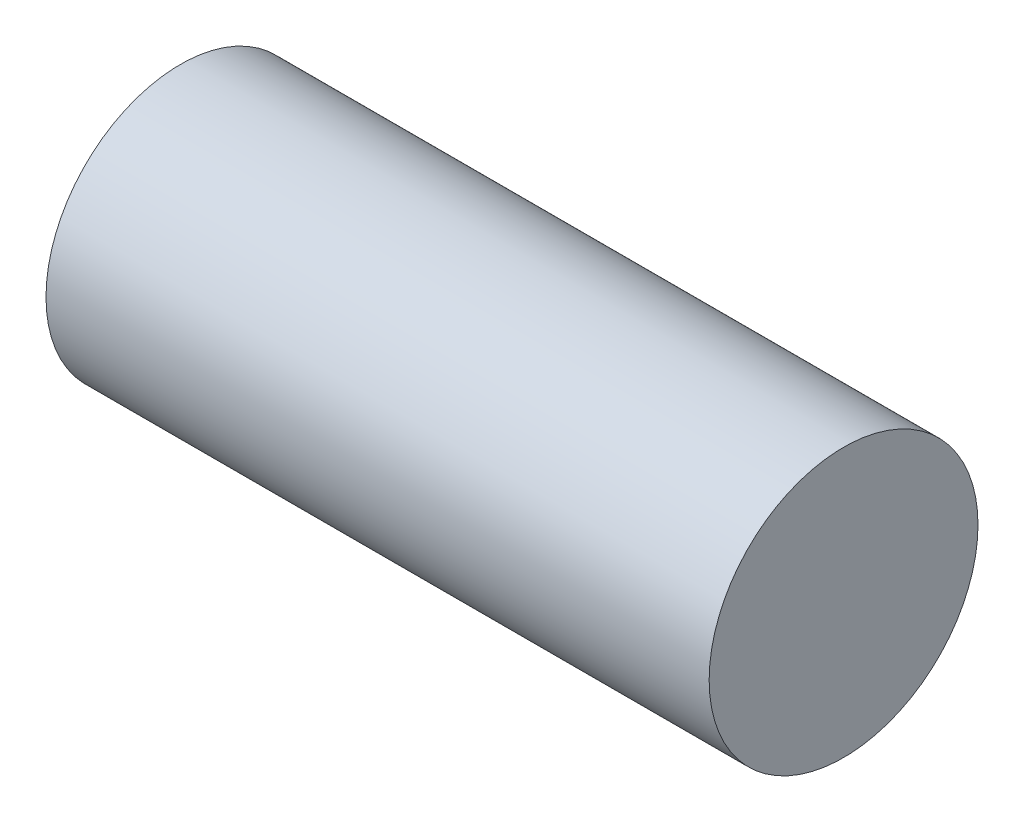
ISO-10303-21;
HEADER;
FILE_DESCRIPTION(('STEP AP214'),'2;1');
FILE_NAME('part.step','',(''),(''),'','','');
FILE_SCHEMA(('AUTOMOTIVE_DESIGN { 1 0 10303 214 1 1 1 1 }'));
ENDSEC;
DATA;
#1=APPLICATION_CONTEXT('core data for automotive mechanical design processes');
#2=APPLICATION_PROTOCOL_DEFINITION('international standard','automotive_design',2000,#1);
#3=PRODUCT_CONTEXT('',#1,'mechanical');
#4=PRODUCT('Part','Part','',(#3));
#5=PRODUCT_RELATED_PRODUCT_CATEGORY('part','',(#4));
#6=PRODUCT_DEFINITION_FORMATION('','',#4);
#7=PRODUCT_DEFINITION_CONTEXT('part definition',#1,'design');
#8=PRODUCT_DEFINITION('design','',#6,#7);
#9=PRODUCT_DEFINITION_SHAPE('','',#8);
#10=(LENGTH_UNIT() NAMED_UNIT(*) SI_UNIT(.MILLI.,.METRE.));
#11=(NAMED_UNIT(*) PLANE_ANGLE_UNIT() SI_UNIT($,.RADIAN.));
#12=(NAMED_UNIT(*) SI_UNIT($,.STERADIAN.) SOLID_ANGLE_UNIT());
#13=UNCERTAINTY_MEASURE_WITH_UNIT(LENGTH_MEASURE(1.E-05),#10,'distance_accuracy_value','');
#14=(GEOMETRIC_REPRESENTATION_CONTEXT(3) GLOBAL_UNCERTAINTY_ASSIGNED_CONTEXT((#13)) GLOBAL_UNIT_ASSIGNED_CONTEXT((#10,
#11,#12)) REPRESENTATION_CONTEXT('',''));
#15=CARTESIAN_POINT('',(0.,0.,0.));
#16=DIRECTION('',(0.,0.,1.));
#17=DIRECTION('',(1.,0.,0.));
#18=AXIS2_PLACEMENT_3D('',#15,#16,#17);
#19=CARTESIAN_POINT('',(-74.,0.,0.));
#20=DIRECTION('',(1.,0.,0.));
#21=DIRECTION('',(0.,0.,-1.));
#22=AXIS2_PLACEMENT_3D('',#19,#20,#21);
#23=CYLINDRICAL_SURFACE('',#22,15.);
#24=CARTESIAN_POINT('',(-74.,0.,0.));
#25=DIRECTION('',(1.,0.,0.));
#26=DIRECTION('',(0.,0.,-1.));
#27=AXIS2_PLACEMENT_3D('',#24,#25,#26);
#28=CIRCLE('',#27,15.);
#29=CARTESIAN_POINT('',(-74.,0.,-15.));
#30=VERTEX_POINT('',#29);
#31=EDGE_CURVE('E10',#30,#30,#28,.T.);
#32=ORIENTED_EDGE('',*,*,#31,.T.);
#33=EDGE_LOOP('',(#32));
#34=FACE_BOUND('',#33,.T.);
#35=CARTESIAN_POINT('',(0.,0.,0.));
#36=DIRECTION('',(1.,0.,0.));
#37=DIRECTION('',(0.,0.,-1.));
#38=AXIS2_PLACEMENT_3D('',#35,#36,#37);
#39=CIRCLE('',#38,15.);
#40=CARTESIAN_POINT('',(0.,0.,-15.));
#41=VERTEX_POINT('',#40);
#42=EDGE_CURVE('E34',#41,#41,#39,.T.);
#43=ORIENTED_EDGE('',*,*,#42,.F.);
#44=EDGE_LOOP('',(#43));
#45=FACE_BOUND('',#44,.T.);
#46=ADVANCED_FACE('F31',(#34,#45),#23,.T.);
#47=CARTESIAN_POINT('',(-74.,0.,0.));
#48=DIRECTION('',(1.,0.,0.));
#49=DIRECTION('',(0.,0.,-1.));
#50=AXIS2_PLACEMENT_3D('',#47,#48,#49);
#51=PLANE('',#50);
#52=ORIENTED_EDGE('',*,*,#31,.F.);
#53=EDGE_LOOP('',(#52));
#54=FACE_BOUND('',#53,.T.);
#55=ADVANCED_FACE('F46',(#54),#51,.F.);
#56=CARTESIAN_POINT('',(0.,0.,0.));
#57=DIRECTION('',(1.,0.,0.));
#58=DIRECTION('',(0.,0.,-1.));
#59=AXIS2_PLACEMENT_3D('',#56,#57,#58);
#60=PLANE('',#59);
#61=ORIENTED_EDGE('',*,*,#42,.T.);
#62=EDGE_LOOP('',(#61));
#63=FACE_BOUND('',#62,.T.);
#64=ADVANCED_FACE('F43',(#63),#60,.T.);
#65=CLOSED_SHELL('',(#46,#55,#64));
#66=MANIFOLD_SOLID_BREP('B2',#65);
#67=ADVANCED_BREP_SHAPE_REPRESENTATION('',(#18,#66),#14);
#68=SHAPE_DEFINITION_REPRESENTATION(#9,#67);
ENDSEC;
END-ISO-10303-21;
